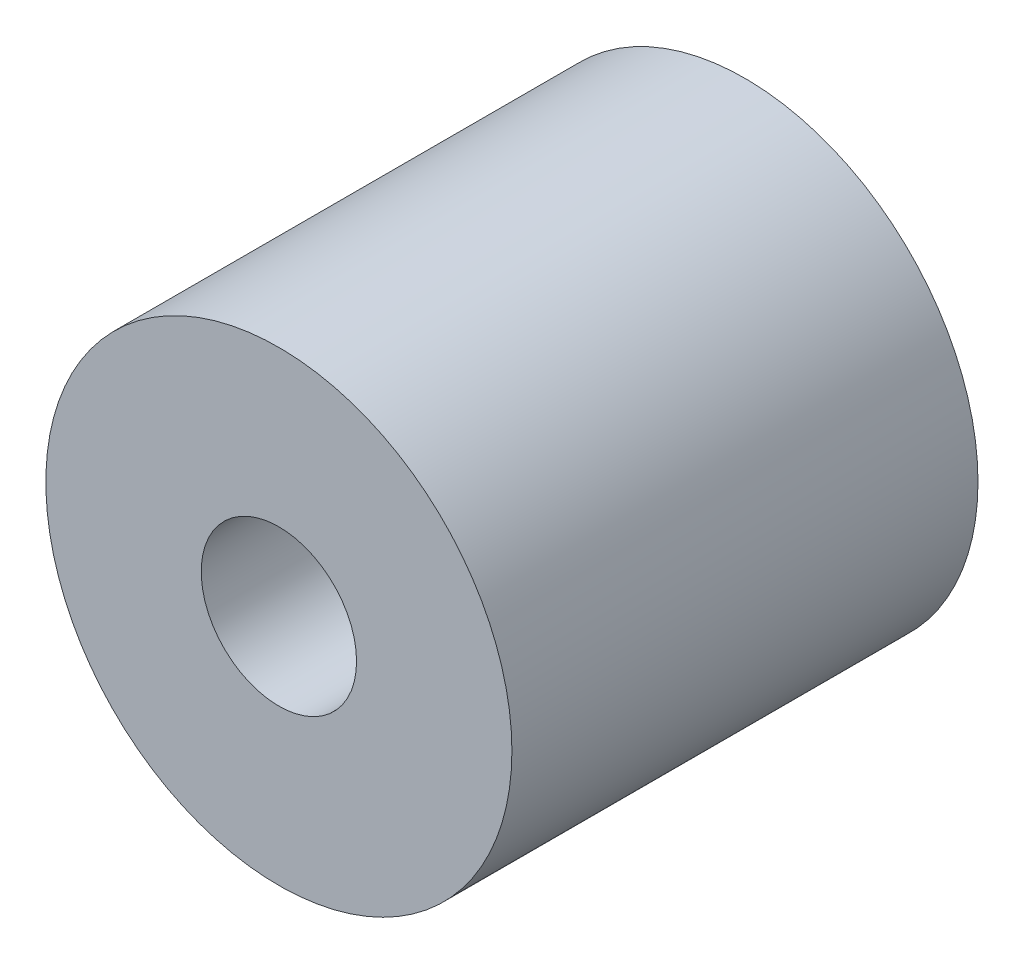
ISO-10303-21;
HEADER;
FILE_DESCRIPTION(('STEP AP214'),'2;1');
FILE_NAME('part.step','',(''),(''),'','','');
FILE_SCHEMA(('AUTOMOTIVE_DESIGN { 1 0 10303 214 1 1 1 1 }'));
ENDSEC;
DATA;
#1=APPLICATION_CONTEXT('core data for automotive mechanical design processes');
#2=APPLICATION_PROTOCOL_DEFINITION('international standard','automotive_design',2000,#1);
#3=PRODUCT_CONTEXT('',#1,'mechanical');
#4=PRODUCT('Part','Part','',(#3));
#5=PRODUCT_RELATED_PRODUCT_CATEGORY('part','',(#4));
#6=PRODUCT_DEFINITION_FORMATION('','',#4);
#7=PRODUCT_DEFINITION_CONTEXT('part definition',#1,'design');
#8=PRODUCT_DEFINITION('design','',#6,#7);
#9=PRODUCT_DEFINITION_SHAPE('','',#8);
#10=(LENGTH_UNIT() NAMED_UNIT(*) SI_UNIT(.MILLI.,.METRE.));
#11=(NAMED_UNIT(*) PLANE_ANGLE_UNIT() SI_UNIT($,.RADIAN.));
#12=(NAMED_UNIT(*) SI_UNIT($,.STERADIAN.) SOLID_ANGLE_UNIT());
#13=UNCERTAINTY_MEASURE_WITH_UNIT(LENGTH_MEASURE(1.E-05),#10,'distance_accuracy_value','');
#14=(GEOMETRIC_REPRESENTATION_CONTEXT(3) GLOBAL_UNCERTAINTY_ASSIGNED_CONTEXT((#13)) GLOBAL_UNIT_ASSIGNED_CONTEXT((#10,
#11,#12)) REPRESENTATION_CONTEXT('',''));
#15=CARTESIAN_POINT('',(0.,0.,0.));
#16=DIRECTION('',(0.,0.,1.));
#17=DIRECTION('',(1.,0.,0.));
#18=AXIS2_PLACEMENT_3D('',#15,#16,#17);
#19=CARTESIAN_POINT('',(0.,0.,15.));
#20=DIRECTION('',(0.,0.,-1.));
#21=DIRECTION('',(-1.,0.,0.));
#22=AXIS2_PLACEMENT_3D('',#19,#20,#21);
#23=CYLINDRICAL_SURFACE('',#22,7.5);
#24=CARTESIAN_POINT('',(0.,0.,15.));
#25=DIRECTION('',(0.,0.,1.));
#26=DIRECTION('',(1.,0.,0.));
#27=AXIS2_PLACEMENT_3D('',#24,#25,#26);
#28=CIRCLE('',#27,7.5);
#29=CARTESIAN_POINT('',(7.5,0.,15.));
#30=VERTEX_POINT('',#29);
#31=EDGE_CURVE('E10',#30,#30,#28,.T.);
#32=ORIENTED_EDGE('',*,*,#31,.F.);
#33=EDGE_LOOP('',(#32));
#34=FACE_BOUND('',#33,.T.);
#35=CARTESIAN_POINT('',(0.,0.,0.));
#36=DIRECTION('',(0.,0.,1.));
#37=DIRECTION('',(1.,0.,0.));
#38=AXIS2_PLACEMENT_3D('',#35,#36,#37);
#39=CIRCLE('',#38,7.5);
#40=CARTESIAN_POINT('',(7.5,0.,0.));
#41=VERTEX_POINT('',#40);
#42=EDGE_CURVE('E33',#41,#41,#39,.T.);
#43=ORIENTED_EDGE('',*,*,#42,.T.);
#44=EDGE_LOOP('',(#43));
#45=FACE_BOUND('',#44,.T.);
#46=ADVANCED_FACE('F30',(#34,#45),#23,.T.);
#47=CARTESIAN_POINT('',(0.,0.,15.));
#48=DIRECTION('',(0.,0.,1.));
#49=DIRECTION('',(1.,0.,0.));
#50=AXIS2_PLACEMENT_3D('',#47,#48,#49);
#51=PLANE('',#50);
#52=CARTESIAN_POINT('',(0.,0.,15.));
#53=DIRECTION('',(0.,0.,1.));
#54=DIRECTION('',(1.,0.,0.));
#55=AXIS2_PLACEMENT_3D('',#52,#53,#54);
#56=CIRCLE('',#55,2.5);
#57=CARTESIAN_POINT('',(2.5,0.,15.));
#58=VERTEX_POINT('',#57);
#59=EDGE_CURVE('E42',#58,#58,#56,.T.);
#60=ORIENTED_EDGE('',*,*,#59,.F.);
#61=EDGE_LOOP('',(#60));
#62=FACE_BOUND('',#61,.T.);
#63=ORIENTED_EDGE('',*,*,#31,.T.);
#64=EDGE_LOOP('',(#63));
#65=FACE_BOUND('',#64,.T.);
#66=ADVANCED_FACE('F57',(#62,#65),#51,.T.);
#67=CARTESIAN_POINT('',(0.,0.,0.));
#68=DIRECTION('',(0.,0.,1.));
#69=DIRECTION('',(1.,0.,0.));
#70=AXIS2_PLACEMENT_3D('',#67,#68,#69);
#71=PLANE('',#70);
#72=CARTESIAN_POINT('',(0.,0.,0.));
#73=DIRECTION('',(0.,0.,1.));
#74=DIRECTION('',(1.,0.,0.));
#75=AXIS2_PLACEMENT_3D('',#72,#73,#74);
#76=CIRCLE('',#75,2.5);
#77=CARTESIAN_POINT('',(2.5,0.,0.));
#78=VERTEX_POINT('',#77);
#79=EDGE_CURVE('E40',#78,#78,#76,.T.);
#80=ORIENTED_EDGE('',*,*,#79,.T.);
#81=EDGE_LOOP('',(#80));
#82=FACE_BOUND('',#81,.T.);
#83=ORIENTED_EDGE('',*,*,#42,.F.);
#84=EDGE_LOOP('',(#83));
#85=FACE_BOUND('',#84,.T.);
#86=ADVANCED_FACE('F48',(#82,#85),#71,.F.);
#87=CARTESIAN_POINT('',(0.,0.,0.));
#88=DIRECTION('',(0.,0.,1.));
#89=DIRECTION('',(1.,0.,0.));
#90=AXIS2_PLACEMENT_3D('',#87,#88,#89);
#91=CYLINDRICAL_SURFACE('',#90,2.5);
#92=ORIENTED_EDGE('',*,*,#79,.F.);
#93=EDGE_LOOP('',(#92));
#94=FACE_BOUND('',#93,.T.);
#95=ORIENTED_EDGE('',*,*,#59,.T.);
#96=EDGE_LOOP('',(#95));
#97=FACE_BOUND('',#96,.T.);
#98=ADVANCED_FACE('F51',(#94,#97),#91,.F.);
#99=CLOSED_SHELL('',(#46,#66,#86,#98));
#100=MANIFOLD_SOLID_BREP('B2',#99);
#101=ADVANCED_BREP_SHAPE_REPRESENTATION('',(#18,#100),#14);
#102=SHAPE_DEFINITION_REPRESENTATION(#9,#101);
ENDSEC;
END-ISO-10303-21;
